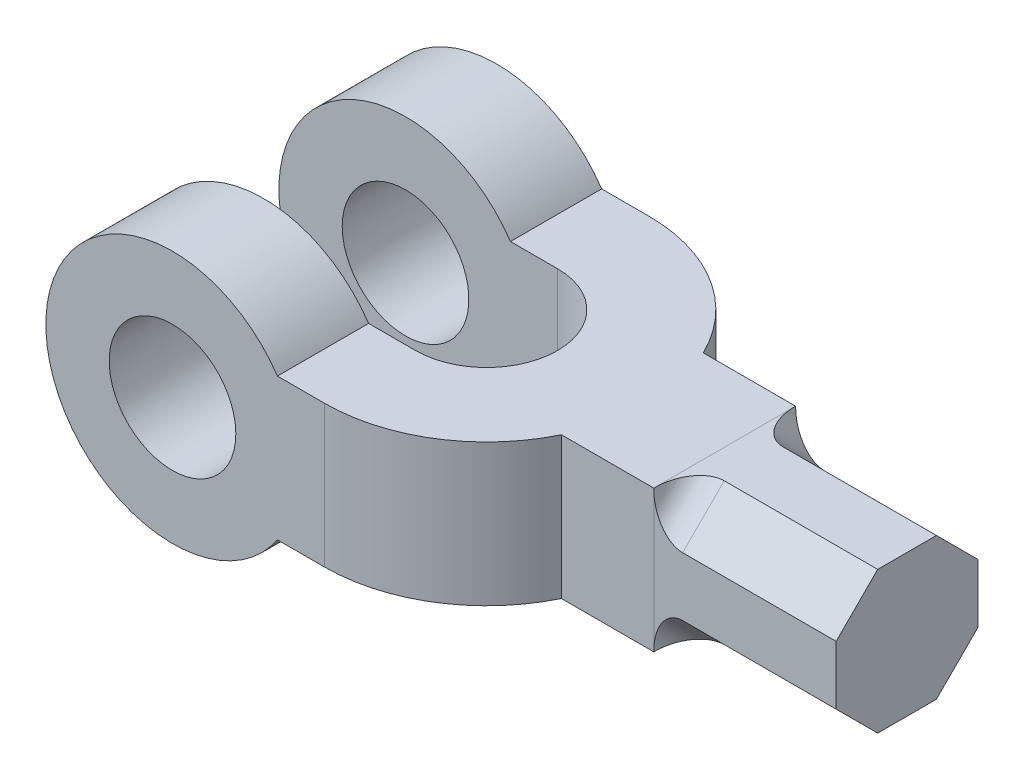
ISO-10303-21;
HEADER;
FILE_DESCRIPTION(('STEP AP214'),'2;1');
FILE_NAME('part.step','',(''),(''),'','','');
FILE_SCHEMA(('AUTOMOTIVE_DESIGN { 1 0 10303 214 1 1 1 1 }'));
ENDSEC;
DATA;
#1=APPLICATION_CONTEXT('core data for automotive mechanical design processes');
#2=APPLICATION_PROTOCOL_DEFINITION('international standard','automotive_design',2000,#1);
#3=PRODUCT_CONTEXT('',#1,'mechanical');
#4=PRODUCT('Part','Part','',(#3));
#5=PRODUCT_RELATED_PRODUCT_CATEGORY('part','',(#4));
#6=PRODUCT_DEFINITION_FORMATION('','',#4);
#7=PRODUCT_DEFINITION_CONTEXT('part definition',#1,'design');
#8=PRODUCT_DEFINITION('design','',#6,#7);
#9=PRODUCT_DEFINITION_SHAPE('','',#8);
#10=(LENGTH_UNIT() NAMED_UNIT(*) SI_UNIT(.MILLI.,.METRE.));
#11=(NAMED_UNIT(*) PLANE_ANGLE_UNIT() SI_UNIT($,.RADIAN.));
#12=(NAMED_UNIT(*) SI_UNIT($,.STERADIAN.) SOLID_ANGLE_UNIT());
#13=UNCERTAINTY_MEASURE_WITH_UNIT(LENGTH_MEASURE(1.E-05),#10,'distance_accuracy_value','');
#14=(GEOMETRIC_REPRESENTATION_CONTEXT(3) GLOBAL_UNCERTAINTY_ASSIGNED_CONTEXT((#13)) GLOBAL_UNIT_ASSIGNED_CONTEXT((#10,
#11,#12)) REPRESENTATION_CONTEXT('',''));
#15=CARTESIAN_POINT('',(0.,0.,0.));
#16=DIRECTION('',(0.,0.,1.));
#17=DIRECTION('',(1.,0.,0.));
#18=AXIS2_PLACEMENT_3D('',#15,#16,#17);
#19=CARTESIAN_POINT('',(77.,14.,14.));
#20=DIRECTION('',(-1.,0.,0.));
#21=DIRECTION('',(0.,0.,1.));
#22=AXIS2_PLACEMENT_3D('',#19,#20,#21);
#23=PLANE('',#22);
#24=CARTESIAN_POINT('',(77.,14.,14.));
#25=DIRECTION('',(0.,-1.,0.));
#26=VECTOR('',#25,1.);
#27=LINE('',#24,#26);
#28=CARTESIAN_POINT('',(77.,14.,14.));
#29=VERTEX_POINT('',#28);
#30=CARTESIAN_POINT('',(77.,13.8600034264656,14.));
#31=VERTEX_POINT('',#30);
#32=EDGE_CURVE('E58',#29,#31,#27,.T.);
#33=ORIENTED_EDGE('',*,*,#32,.T.);
#34=DIRECTION('',(0.,-0.707125784108994,0.707087777753399));
#35=VECTOR('',#34,1.);
#36=CARTESIAN_POINT('',(77.,18.0302444828851,9.82998308427523));
#37=LINE('',#36,#35);
#38=CARTESIAN_POINT('',(77.,14.,13.8600109509537));
#39=VERTEX_POINT('',#38);
#40=EDGE_CURVE('E418',#31,#39,#37,.F.);
#41=ORIENTED_EDGE('',*,*,#40,.T.);
#42=CARTESIAN_POINT('',(77.,14.,14.));
#43=DIRECTION('',(0.,0.,-1.));
#44=VECTOR('',#43,1.);
#45=LINE('',#42,#44);
#46=EDGE_CURVE('E742',#29,#39,#45,.T.);
#47=ORIENTED_EDGE('',*,*,#46,.F.);
#48=EDGE_LOOP('',(#33,#41,#47));
#49=FACE_BOUND('',#48,.T.);
#50=ADVANCED_FACE('F39',(#49),#23,.F.);
#51=CARTESIAN_POINT('',(77.,14.,-13.8600034264656));
#52=DIRECTION('',(0.,0.,-1.));
#53=VECTOR('',#52,1.);
#54=LINE('',#51,#53);
#55=CARTESIAN_POINT('',(77.,14.,-13.8600034264656));
#56=VERTEX_POINT('',#55);
#57=CARTESIAN_POINT('',(77.,14.,-14.));
#58=VERTEX_POINT('',#57);
#59=EDGE_CURVE('E409',#56,#58,#54,.T.);
#60=ORIENTED_EDGE('',*,*,#59,.F.);
#61=DIRECTION('',(0.,0.707087777753399,0.707125784108994));
#62=VECTOR('',#61,1.);
#63=CARTESIAN_POINT('',(77.,9.82998308427523,-18.0302444828851));
#64=LINE('',#63,#62);
#65=CARTESIAN_POINT('',(77.,13.8600109509537,-14.));
#66=VERTEX_POINT('',#65);
#67=EDGE_CURVE('E412',#56,#66,#64,.F.);
#68=ORIENTED_EDGE('',*,*,#67,.T.);
#69=CARTESIAN_POINT('',(77.,14.,-14.));
#70=DIRECTION('',(0.,-1.,0.));
#71=VECTOR('',#70,1.);
#72=LINE('',#69,#71);
#73=EDGE_CURVE('E296',#58,#66,#72,.T.);
#74=ORIENTED_EDGE('',*,*,#73,.F.);
#75=EDGE_LOOP('',(#60,#68,#74));
#76=FACE_BOUND('',#75,.T.);
#77=ADVANCED_FACE('F373',(#76),#23,.F.);
#78=CARTESIAN_POINT('',(77.,-13.8600034264656,-14.));
#79=DIRECTION('',(0.,-1.,0.));
#80=VECTOR('',#79,1.);
#81=LINE('',#78,#80);
#82=CARTESIAN_POINT('',(77.,-13.8600034264656,-14.));
#83=VERTEX_POINT('',#82);
#84=CARTESIAN_POINT('',(77.,-14.,-14.));
#85=VERTEX_POINT('',#84);
#86=EDGE_CURVE('E773',#83,#85,#81,.T.);
#87=ORIENTED_EDGE('',*,*,#86,.F.);
#88=DIRECTION('',(0.,0.707125784108994,-0.707087777753399));
#89=VECTOR('',#88,1.);
#90=CARTESIAN_POINT('',(77.,-18.0302444828851,-9.82998308427523));
#91=LINE('',#90,#89);
#92=CARTESIAN_POINT('',(77.,-14.,-13.8600109509537));
#93=VERTEX_POINT('',#92);
#94=EDGE_CURVE('E759',#83,#93,#91,.F.);
#95=ORIENTED_EDGE('',*,*,#94,.T.);
#96=CARTESIAN_POINT('',(77.,-14.,-13.8600109509537));
#97=DIRECTION('',(0.,0.,-1.));
#98=VECTOR('',#97,1.);
#99=LINE('',#96,#98);
#100=EDGE_CURVE('E251',#93,#85,#99,.T.);
#101=ORIENTED_EDGE('',*,*,#100,.T.);
#102=EDGE_LOOP('',(#87,#95,#101));
#103=FACE_BOUND('',#102,.T.);
#104=ADVANCED_FACE('F864',(#103),#23,.F.);
#105=CARTESIAN_POINT('',(77.,-14.,14.));
#106=DIRECTION('',(0.,0.,-1.));
#107=VECTOR('',#106,1.);
#108=LINE('',#105,#107);
#109=CARTESIAN_POINT('',(77.,-14.,14.));
#110=VERTEX_POINT('',#109);
#111=CARTESIAN_POINT('',(77.,-14.,13.8600034264656));
#112=VERTEX_POINT('',#111);
#113=EDGE_CURVE('E254',#110,#112,#108,.T.);
#114=ORIENTED_EDGE('',*,*,#113,.T.);
#115=DIRECTION('',(0.,-0.707087777753399,-0.707125784108994));
#116=VECTOR('',#115,1.);
#117=CARTESIAN_POINT('',(77.,-9.82998308427523,18.0302444828851));
#118=LINE('',#117,#116);
#119=CARTESIAN_POINT('',(77.,-13.8600109509537,14.));
#120=VERTEX_POINT('',#119);
#121=EDGE_CURVE('E751',#112,#120,#118,.F.);
#122=ORIENTED_EDGE('',*,*,#121,.T.);
#123=CARTESIAN_POINT('',(77.,-13.8600109509537,14.));
#124=DIRECTION('',(0.,-1.,0.));
#125=VECTOR('',#124,1.);
#126=LINE('',#123,#125);
#127=EDGE_CURVE('E788',#120,#110,#126,.T.);
#128=ORIENTED_EDGE('',*,*,#127,.T.);
#129=EDGE_LOOP('',(#114,#122,#128));
#130=FACE_BOUND('',#129,.T.);
#131=ADVANCED_FACE('F374',(#130),#23,.F.);
#132=CARTESIAN_POINT('',(30.,-14.,0.));
#133=DIRECTION('',(0.,1.,0.));
#134=DIRECTION('',(0.,0.,1.));
#135=AXIS2_PLACEMENT_3D('',#132,#133,#134);
#136=CYLINDRICAL_SURFACE('',#135,32.);
#137=CARTESIAN_POINT('',(30.,14.,0.));
#138=DIRECTION('',(0.,1.,0.));
#139=DIRECTION('',(0.,0.,-1.));
#140=AXIS2_PLACEMENT_3D('',#137,#138,#139);
#141=CIRCLE('',#140,32.);
#142=CARTESIAN_POINT('',(58.7749891398763,14.,-14.));
#143=VERTEX_POINT('',#142);
#144=CARTESIAN_POINT('',(30.,14.,-32.));
#145=VERTEX_POINT('',#144);
#146=EDGE_CURVE('E307',#143,#145,#141,.T.);
#147=ORIENTED_EDGE('',*,*,#146,.F.);
#148=DIRECTION('',(0.,1.,0.));
#149=VECTOR('',#148,1.);
#150=CARTESIAN_POINT('',(58.7749891398763,-14.,-14.));
#151=LINE('',#150,#149);
#152=CARTESIAN_POINT('',(58.7749891398763,-14.,-14.));
#153=VERTEX_POINT('',#152);
#154=EDGE_CURVE('E349',#143,#153,#151,.F.);
#155=ORIENTED_EDGE('',*,*,#154,.T.);
#156=CARTESIAN_POINT('',(30.,-14.,0.));
#157=DIRECTION('',(0.,1.,0.));
#158=DIRECTION('',(0.,0.,-1.));
#159=AXIS2_PLACEMENT_3D('',#156,#157,#158);
#160=CIRCLE('',#159,32.);
#161=CARTESIAN_POINT('',(30.,-14.,-32.));
#162=VERTEX_POINT('',#161);
#163=EDGE_CURVE('E300',#153,#162,#160,.T.);
#164=ORIENTED_EDGE('',*,*,#163,.T.);
#165=DIRECTION('',(0.,1.,0.));
#166=VECTOR('',#165,1.);
#167=CARTESIAN_POINT('',(30.,-14.,-32.));
#168=LINE('',#167,#166);
#169=EDGE_CURVE('E304',#162,#145,#168,.T.);
#170=ORIENTED_EDGE('',*,*,#169,.T.);
#171=EDGE_LOOP('',(#147,#155,#164,#170));
#172=FACE_BOUND('',#171,.T.);
#173=ADVANCED_FACE('F804',(#172),#136,.T.);
#174=CARTESIAN_POINT('',(30.,-14.,32.));
#175=VERTEX_POINT('',#174);
#176=CARTESIAN_POINT('',(58.7749891398763,-14.,14.));
#177=VERTEX_POINT('',#176);
#178=EDGE_CURVE('E302',#175,#177,#160,.T.);
#179=ORIENTED_EDGE('',*,*,#178,.T.);
#180=DIRECTION('',(0.,1.,0.));
#181=VECTOR('',#180,1.);
#182=CARTESIAN_POINT('',(58.7749891398763,-14.,14.));
#183=LINE('',#182,#181);
#184=CARTESIAN_POINT('',(58.7749891398763,14.,14.));
#185=VERTEX_POINT('',#184);
#186=EDGE_CURVE('E318',#177,#185,#183,.T.);
#187=ORIENTED_EDGE('',*,*,#186,.T.);
#188=CARTESIAN_POINT('',(30.,14.,32.));
#189=VERTEX_POINT('',#188);
#190=EDGE_CURVE('E301',#189,#185,#141,.T.);
#191=ORIENTED_EDGE('',*,*,#190,.F.);
#192=DIRECTION('',(0.,1.,0.));
#193=VECTOR('',#192,1.);
#194=CARTESIAN_POINT('',(30.,-14.,32.));
#195=LINE('',#194,#193);
#196=EDGE_CURVE('E325',#175,#189,#195,.T.);
#197=ORIENTED_EDGE('',*,*,#196,.F.);
#198=EDGE_LOOP('',(#179,#187,#191,#197));
#199=FACE_BOUND('',#198,.T.);
#200=ADVANCED_FACE('F516',(#199),#136,.T.);
#201=CARTESIAN_POINT('',(20.712315177208,14.,32.));
#202=DIRECTION('',(0.,-1.,0.));
#203=DIRECTION('',(0.,0.,-1.));
#204=AXIS2_PLACEMENT_3D('',#201,#202,#203);
#205=PLANE('',#204);
#206=DIRECTION('',(-1.,0.,0.));
#207=VECTOR('',#206,1.);
#208=CARTESIAN_POINT('',(47.,14.,-14.));
#209=LINE('',#208,#207);
#210=EDGE_CURVE('E790',#58,#143,#209,.T.);
#211=ORIENTED_EDGE('',*,*,#210,.T.);
#212=ORIENTED_EDGE('',*,*,#146,.T.);
#213=DIRECTION('',(-1.,0.,0.));
#214=VECTOR('',#213,1.);
#215=CARTESIAN_POINT('',(20.712315177208,14.,-32.));
#216=LINE('',#215,#214);
#217=CARTESIAN_POINT('',(20.712315177208,14.,-32.));
#218=VERTEX_POINT('',#217);
#219=EDGE_CURVE('E280',#145,#218,#216,.T.);
#220=ORIENTED_EDGE('',*,*,#219,.T.);
#221=DIRECTION('',(0.,0.,-1.));
#222=VECTOR('',#221,1.);
#223=CARTESIAN_POINT('',(20.712315177208,14.,32.));
#224=LINE('',#223,#222);
#225=CARTESIAN_POINT('',(20.712315177208,14.,-14.));
#226=VERTEX_POINT('',#225);
#227=EDGE_CURVE('E291',#226,#218,#224,.T.);
#228=ORIENTED_EDGE('',*,*,#227,.F.);
#229=DIRECTION('',(1.,0.,0.));
#230=VECTOR('',#229,1.);
#231=CARTESIAN_POINT('',(20.712315177208,14.,-14.));
#232=LINE('',#231,#230);
#233=CARTESIAN_POINT('',(30.,14.,-14.));
#234=VERTEX_POINT('',#233);
#235=EDGE_CURVE('E274',#226,#234,#232,.T.);
#236=ORIENTED_EDGE('',*,*,#235,.T.);
#237=CARTESIAN_POINT('',(30.,14.,0.));
#238=DIRECTION('',(0.,-1.,0.));
#239=DIRECTION('',(0.,0.,-1.));
#240=AXIS2_PLACEMENT_3D('',#237,#238,#239);
#241=CIRCLE('',#240,14.);
#242=CARTESIAN_POINT('',(30.,14.,14.));
#243=VERTEX_POINT('',#242);
#244=EDGE_CURVE('E293',#234,#243,#241,.T.);
#245=ORIENTED_EDGE('',*,*,#244,.T.);
#246=DIRECTION('',(-1.,0.,0.));
#247=VECTOR('',#246,1.);
#248=CARTESIAN_POINT('',(20.712315177208,14.,14.));
#249=LINE('',#248,#247);
#250=CARTESIAN_POINT('',(20.712315177208,14.,14.));
#251=VERTEX_POINT('',#250);
#252=EDGE_CURVE('E332',#243,#251,#249,.T.);
#253=ORIENTED_EDGE('',*,*,#252,.T.);
#254=DIRECTION('',(0.,0.,-1.));
#255=VECTOR('',#254,1.);
#256=CARTESIAN_POINT('',(20.712315177208,14.,32.));
#257=LINE('',#256,#255);
#258=CARTESIAN_POINT('',(20.712315177208,14.,32.));
#259=VERTEX_POINT('',#258);
#260=EDGE_CURVE('E335',#259,#251,#257,.T.);
#261=ORIENTED_EDGE('',*,*,#260,.F.);
#262=DIRECTION('',(-1.,0.,0.));
#263=VECTOR('',#262,1.);
#264=CARTESIAN_POINT('',(20.712315177208,14.,32.));
#265=LINE('',#264,#263);
#266=EDGE_CURVE('E323',#189,#259,#265,.T.);
#267=ORIENTED_EDGE('',*,*,#266,.F.);
#268=ORIENTED_EDGE('',*,*,#190,.T.);
#269=DIRECTION('',(1.,0.,0.));
#270=VECTOR('',#269,1.);
#271=CARTESIAN_POINT('',(47.,14.,14.));
#272=LINE('',#271,#270);
#273=EDGE_CURVE('E395',#185,#29,#272,.T.);
#274=ORIENTED_EDGE('',*,*,#273,.T.);
#275=ORIENTED_EDGE('',*,*,#46,.T.);
#276=CARTESIAN_POINT('',(77.,13.9998441512061,5.79930972727387));
#277=DIRECTION('',(0.,-2.68745517690249E-05,0.999999999638879));
#278=VECTOR('',#277,1.);
#279=LINE('',#276,#278);
#280=CARTESIAN_POINT('',(77.,13.9999569225355,5.79930973146224));
#281=VERTEX_POINT('',#280);
#282=EDGE_CURVE('E11',#281,#39,#279,.T.);
#283=ORIENTED_EDGE('',*,*,#282,.F.);
#284=CARTESIAN_POINT('',(77.,14.0001558401979,-5.79861362740442));
#285=DIRECTION('',(0.,-2.68745517690833E-05,0.999999999638879));
#286=VECTOR('',#285,1.);
#287=LINE('',#284,#286);
#288=CARTESIAN_POINT('',(77.,14.0000430716729,-5.79867001469759));
#289=VERTEX_POINT('',#288);
#290=EDGE_CURVE('E245',#289,#281,#287,.T.);
#291=ORIENTED_EDGE('',*,*,#290,.F.);
#292=CARTESIAN_POINT('',(77.,14.,-5.79867001469759));
#293=DIRECTION('',(0.,0.,-1.));
#294=VECTOR('',#293,1.);
#295=LINE('',#292,#294);
#296=EDGE_CURVE('E499',#289,#56,#295,.T.);
#297=ORIENTED_EDGE('',*,*,#296,.T.);
#298=ORIENTED_EDGE('',*,*,#59,.T.);
#299=EDGE_LOOP('',(#211,#212,#220,#228,#236,#245,#253,#261,#267,#268,#274,#275,#283,#291,#297,#298));
#300=FACE_BOUND('',#299,.T.);
#301=ADVANCED_FACE('F507',(#300),#205,.F.);
#302=CARTESIAN_POINT('',(0.,0.,32.));
#303=DIRECTION('',(0.,0.,-1.));
#304=DIRECTION('',(-1.,0.,0.));
#305=AXIS2_PLACEMENT_3D('',#302,#303,#304);
#306=CYLINDRICAL_SURFACE('',#305,25.);
#307=ORIENTED_EDGE('',*,*,#260,.T.);
#308=CARTESIAN_POINT('',(0.,0.,14.));
#309=DIRECTION('',(0.,0.,1.));
#310=DIRECTION('',(1.,0.,0.));
#311=AXIS2_PLACEMENT_3D('',#308,#309,#310);
#312=CIRCLE('',#311,25.);
#313=CARTESIAN_POINT('',(20.712315177208,-14.,14.));
#314=VERTEX_POINT('',#313);
#315=EDGE_CURVE('E336',#251,#314,#312,.T.);
#316=ORIENTED_EDGE('',*,*,#315,.T.);
#317=DIRECTION('',(0.,0.,-1.));
#318=VECTOR('',#317,1.);
#319=CARTESIAN_POINT('',(20.712315177208,-14.,32.));
#320=LINE('',#319,#318);
#321=CARTESIAN_POINT('',(20.712315177208,-14.,32.));
#322=VERTEX_POINT('',#321);
#323=EDGE_CURVE('E339',#322,#314,#320,.T.);
#324=ORIENTED_EDGE('',*,*,#323,.F.);
#325=CARTESIAN_POINT('',(0.,0.,32.));
#326=DIRECTION('',(0.,0.,1.));
#327=DIRECTION('',(1.,0.,0.));
#328=AXIS2_PLACEMENT_3D('',#325,#326,#327);
#329=CIRCLE('',#328,25.);
#330=EDGE_CURVE('E321',#259,#322,#329,.T.);
#331=ORIENTED_EDGE('',*,*,#330,.F.);
#332=EDGE_LOOP('',(#307,#316,#324,#331));
#333=FACE_BOUND('',#332,.T.);
#334=ADVANCED_FACE('F475',(#333),#306,.T.);
#335=CARTESIAN_POINT('',(20.712315177208,-14.,32.));
#336=DIRECTION('',(0.,1.,0.));
#337=DIRECTION('',(0.,0.,1.));
#338=AXIS2_PLACEMENT_3D('',#335,#336,#337);
#339=PLANE('',#338);
#340=ORIENTED_EDGE('',*,*,#163,.F.);
#341=DIRECTION('',(-1.,0.,0.));
#342=VECTOR('',#341,1.);
#343=CARTESIAN_POINT('',(47.,-14.,-14.));
#344=LINE('',#343,#342);
#345=EDGE_CURVE('E794',#85,#153,#344,.T.);
#346=ORIENTED_EDGE('',*,*,#345,.F.);
#347=ORIENTED_EDGE('',*,*,#100,.F.);
#348=CARTESIAN_POINT('',(77.,-13.9998441512061,-5.79930972727387));
#349=DIRECTION('',(0.,2.68745517692401E-05,-0.999999999638879));
#350=VECTOR('',#349,1.);
#351=LINE('',#348,#350);
#352=CARTESIAN_POINT('',(77.,-13.9999569225355,-5.79930973146223));
#353=VERTEX_POINT('',#352);
#354=EDGE_CURVE('E744',#353,#93,#351,.T.);
#355=ORIENTED_EDGE('',*,*,#354,.F.);
#356=CARTESIAN_POINT('',(77.,-14.0001558401979,5.79861362740443));
#357=DIRECTION('',(0.,2.68745517692329E-05,-0.999999999638879));
#358=VECTOR('',#357,1.);
#359=LINE('',#356,#358);
#360=CARTESIAN_POINT('',(77.,-14.0000430716729,5.79867001469758));
#361=VERTEX_POINT('',#360);
#362=EDGE_CURVE('E699',#361,#353,#359,.T.);
#363=ORIENTED_EDGE('',*,*,#362,.F.);
#364=CARTESIAN_POINT('',(77.,-14.,5.79867001469758));
#365=DIRECTION('',(0.,0.,1.));
#366=VECTOR('',#365,1.);
#367=LINE('',#364,#366);
#368=EDGE_CURVE('E453',#361,#112,#367,.T.);
#369=ORIENTED_EDGE('',*,*,#368,.T.);
#370=ORIENTED_EDGE('',*,*,#113,.F.);
#371=DIRECTION('',(1.,0.,0.));
#372=VECTOR('',#371,1.);
#373=CARTESIAN_POINT('',(47.,-14.,14.));
#374=LINE('',#373,#372);
#375=EDGE_CURVE('E793',#177,#110,#374,.T.);
#376=ORIENTED_EDGE('',*,*,#375,.F.);
#377=ORIENTED_EDGE('',*,*,#178,.F.);
#378=DIRECTION('',(1.,0.,0.));
#379=VECTOR('',#378,1.);
#380=CARTESIAN_POINT('',(20.712315177208,-14.,32.));
#381=LINE('',#380,#379);
#382=EDGE_CURVE('E319',#322,#175,#381,.T.);
#383=ORIENTED_EDGE('',*,*,#382,.F.);
#384=ORIENTED_EDGE('',*,*,#323,.T.);
#385=DIRECTION('',(1.,0.,0.));
#386=VECTOR('',#385,1.);
#387=CARTESIAN_POINT('',(20.712315177208,-14.,14.));
#388=LINE('',#387,#386);
#389=CARTESIAN_POINT('',(30.,-14.,14.));
#390=VERTEX_POINT('',#389);
#391=EDGE_CURVE('E331',#314,#390,#388,.T.);
#392=ORIENTED_EDGE('',*,*,#391,.T.);
#393=CARTESIAN_POINT('',(30.,-14.,0.));
#394=DIRECTION('',(0.,-1.,0.));
#395=DIRECTION('',(0.,0.,-1.));
#396=AXIS2_PLACEMENT_3D('',#393,#394,#395);
#397=CIRCLE('',#396,14.);
#398=CARTESIAN_POINT('',(30.,-14.,-14.));
#399=VERTEX_POINT('',#398);
#400=EDGE_CURVE('E297',#399,#390,#397,.T.);
#401=ORIENTED_EDGE('',*,*,#400,.F.);
#402=DIRECTION('',(-1.,0.,0.));
#403=VECTOR('',#402,1.);
#404=CARTESIAN_POINT('',(20.712315177208,-14.,-14.));
#405=LINE('',#404,#403);
#406=CARTESIAN_POINT('',(20.712315177208,-14.,-14.));
#407=VERTEX_POINT('',#406);
#408=EDGE_CURVE('E267',#399,#407,#405,.T.);
#409=ORIENTED_EDGE('',*,*,#408,.T.);
#410=DIRECTION('',(0.,0.,-1.));
#411=VECTOR('',#410,1.);
#412=CARTESIAN_POINT('',(20.712315177208,-14.,32.));
#413=LINE('',#412,#411);
#414=CARTESIAN_POINT('',(20.712315177208,-14.,-32.));
#415=VERTEX_POINT('',#414);
#416=EDGE_CURVE('E289',#407,#415,#413,.T.);
#417=ORIENTED_EDGE('',*,*,#416,.T.);
#418=DIRECTION('',(1.,0.,0.));
#419=VECTOR('',#418,1.);
#420=CARTESIAN_POINT('',(20.712315177208,-14.,-32.));
#421=LINE('',#420,#419);
#422=EDGE_CURVE('E286',#415,#162,#421,.T.);
#423=ORIENTED_EDGE('',*,*,#422,.T.);
#424=EDGE_LOOP('',(#340,#346,#347,#355,#363,#369,#370,#376,#377,#383,#384,#392,#401,#409,#417,#423));
#425=FACE_BOUND('',#424,.T.);
#426=ADVANCED_FACE('F464',(#425),#339,.F.);
#427=CARTESIAN_POINT('',(0.,0.,32.));
#428=DIRECTION('',(0.,0.,-1.));
#429=DIRECTION('',(-1.,0.,0.));
#430=AXIS2_PLACEMENT_3D('',#427,#428,#429);
#431=CYLINDRICAL_SURFACE('',#430,12.5);
#432=CARTESIAN_POINT('',(0.,0.,14.));
#433=DIRECTION('',(0.,0.,1.));
#434=DIRECTION('',(1.,0.,0.));
#435=AXIS2_PLACEMENT_3D('',#432,#433,#434);
#436=CIRCLE('',#435,12.5);
#437=CARTESIAN_POINT('',(12.5,0.,14.));
#438=VERTEX_POINT('',#437);
#439=EDGE_CURVE('E315',#438,#438,#436,.T.);
#440=ORIENTED_EDGE('',*,*,#439,.F.);
#441=EDGE_LOOP('',(#440));
#442=FACE_BOUND('',#441,.T.);
#443=CARTESIAN_POINT('',(0.,0.,32.));
#444=DIRECTION('',(0.,0.,1.));
#445=DIRECTION('',(1.,0.,0.));
#446=AXIS2_PLACEMENT_3D('',#443,#444,#445);
#447=CIRCLE('',#446,12.5);
#448=CARTESIAN_POINT('',(12.5,0.,32.));
#449=VERTEX_POINT('',#448);
#450=EDGE_CURVE('E328',#449,#449,#447,.T.);
#451=ORIENTED_EDGE('',*,*,#450,.T.);
#452=EDGE_LOOP('',(#451));
#453=FACE_BOUND('',#452,.T.);
#454=ADVANCED_FACE('F474',(#442,#453),#431,.F.);
#455=CARTESIAN_POINT('',(0.,0.,32.));
#456=DIRECTION('',(0.,0.,1.));
#457=DIRECTION('',(1.,0.,0.));
#458=AXIS2_PLACEMENT_3D('',#455,#456,#457);
#459=PLANE('',#458);
#460=ORIENTED_EDGE('',*,*,#196,.T.);
#461=ORIENTED_EDGE('',*,*,#266,.T.);
#462=ORIENTED_EDGE('',*,*,#330,.T.);
#463=ORIENTED_EDGE('',*,*,#382,.T.);
#464=EDGE_LOOP('',(#460,#461,#462,#463));
#465=FACE_BOUND('',#464,.T.);
#466=ORIENTED_EDGE('',*,*,#450,.F.);
#467=EDGE_LOOP('',(#466));
#468=FACE_BOUND('',#467,.T.);
#469=ADVANCED_FACE('F830',(#465,#468),#459,.T.);
#470=CARTESIAN_POINT('',(-80.,-32.,14.));
#471=DIRECTION('',(0.,0.,1.));
#472=DIRECTION('',(1.,0.,0.));
#473=AXIS2_PLACEMENT_3D('',#470,#471,#472);
#474=PLANE('',#473);
#475=ORIENTED_EDGE('',*,*,#439,.T.);
#476=EDGE_LOOP('',(#475));
#477=FACE_BOUND('',#476,.T.);
#478=DIRECTION('',(0.,1.,0.));
#479=VECTOR('',#478,1.);
#480=CARTESIAN_POINT('',(30.,-32.,14.));
#481=LINE('',#480,#479);
#482=EDGE_CURVE('E312',#390,#243,#481,.T.);
#483=ORIENTED_EDGE('',*,*,#482,.F.);
#484=ORIENTED_EDGE('',*,*,#391,.F.);
#485=ORIENTED_EDGE('',*,*,#315,.F.);
#486=ORIENTED_EDGE('',*,*,#252,.F.);
#487=EDGE_LOOP('',(#483,#484,#485,#486));
#488=FACE_BOUND('',#487,.T.);
#489=ADVANCED_FACE('F477',(#477,#488),#474,.F.);
#490=CARTESIAN_POINT('',(30.,-14.,0.));
#491=DIRECTION('',(0.,1.,0.));
#492=DIRECTION('',(0.,0.,1.));
#493=AXIS2_PLACEMENT_3D('',#490,#491,#492);
#494=CYLINDRICAL_SURFACE('',#493,14.);
#495=ORIENTED_EDGE('',*,*,#244,.F.);
#496=DIRECTION('',(0.,1.,0.));
#497=VECTOR('',#496,1.);
#498=CARTESIAN_POINT('',(30.,-14.,-14.));
#499=LINE('',#498,#497);
#500=EDGE_CURVE('E310',#399,#234,#499,.T.);
#501=ORIENTED_EDGE('',*,*,#500,.F.);
#502=ORIENTED_EDGE('',*,*,#400,.T.);
#503=ORIENTED_EDGE('',*,*,#482,.T.);
#504=EDGE_LOOP('',(#495,#501,#502,#503));
#505=FACE_BOUND('',#504,.T.);
#506=ADVANCED_FACE('F818',(#505),#494,.F.);
#507=CARTESIAN_POINT('',(0.,0.,32.));
#508=DIRECTION('',(0.,0.,-1.));
#509=DIRECTION('',(-1.,0.,0.));
#510=AXIS2_PLACEMENT_3D('',#507,#508,#509);
#511=CYLINDRICAL_SURFACE('',#510,25.);
#512=ORIENTED_EDGE('',*,*,#416,.F.);
#513=CARTESIAN_POINT('',(0.,0.,-14.));
#514=DIRECTION('',(0.,0.,-1.));
#515=DIRECTION('',(-1.,0.,0.));
#516=AXIS2_PLACEMENT_3D('',#513,#514,#515);
#517=CIRCLE('',#516,25.);
#518=EDGE_CURVE('E270',#407,#226,#517,.T.);
#519=ORIENTED_EDGE('',*,*,#518,.T.);
#520=ORIENTED_EDGE('',*,*,#227,.T.);
#521=CARTESIAN_POINT('',(0.,0.,-32.));
#522=DIRECTION('',(0.,0.,1.));
#523=DIRECTION('',(1.,0.,0.));
#524=AXIS2_PLACEMENT_3D('',#521,#522,#523);
#525=CIRCLE('',#524,25.);
#526=EDGE_CURVE('E283',#218,#415,#525,.T.);
#527=ORIENTED_EDGE('',*,*,#526,.T.);
#528=EDGE_LOOP('',(#512,#519,#520,#527));
#529=FACE_BOUND('',#528,.T.);
#530=ADVANCED_FACE('F813',(#529),#511,.T.);
#531=CARTESIAN_POINT('',(0.,0.,-32.));
#532=DIRECTION('',(0.,0.,1.));
#533=DIRECTION('',(1.,0.,0.));
#534=AXIS2_PLACEMENT_3D('',#531,#532,#533);
#535=PLANE('',#534);
#536=ORIENTED_EDGE('',*,*,#169,.F.);
#537=ORIENTED_EDGE('',*,*,#422,.F.);
#538=ORIENTED_EDGE('',*,*,#526,.F.);
#539=ORIENTED_EDGE('',*,*,#219,.F.);
#540=EDGE_LOOP('',(#536,#537,#538,#539));
#541=FACE_BOUND('',#540,.T.);
#542=CARTESIAN_POINT('',(0.,0.,-32.));
#543=DIRECTION('',(0.,0.,1.));
#544=DIRECTION('',(1.,0.,0.));
#545=AXIS2_PLACEMENT_3D('',#542,#543,#544);
#546=CIRCLE('',#545,12.5);
#547=CARTESIAN_POINT('',(12.5,0.,-32.));
#548=VERTEX_POINT('',#547);
#549=EDGE_CURVE('E277',#548,#548,#546,.T.);
#550=ORIENTED_EDGE('',*,*,#549,.T.);
#551=EDGE_LOOP('',(#550));
#552=FACE_BOUND('',#551,.T.);
#553=ADVANCED_FACE('F809',(#541,#552),#535,.F.);
#554=CARTESIAN_POINT('',(0.,0.,32.));
#555=DIRECTION('',(0.,0.,-1.));
#556=DIRECTION('',(-1.,0.,0.));
#557=AXIS2_PLACEMENT_3D('',#554,#555,#556);
#558=CYLINDRICAL_SURFACE('',#557,12.5);
#559=CARTESIAN_POINT('',(0.,0.,-14.));
#560=DIRECTION('',(0.,0.,-1.));
#561=DIRECTION('',(-1.,0.,0.));
#562=AXIS2_PLACEMENT_3D('',#559,#560,#561);
#563=CIRCLE('',#562,12.5);
#564=CARTESIAN_POINT('',(-12.5,0.,-14.));
#565=VERTEX_POINT('',#564);
#566=EDGE_CURVE('E271',#565,#565,#563,.T.);
#567=ORIENTED_EDGE('',*,*,#566,.F.);
#568=EDGE_LOOP('',(#567));
#569=FACE_BOUND('',#568,.T.);
#570=ORIENTED_EDGE('',*,*,#549,.F.);
#571=EDGE_LOOP('',(#570));
#572=FACE_BOUND('',#571,.T.);
#573=ADVANCED_FACE('F1036',(#569,#572),#558,.F.);
#574=CARTESIAN_POINT('',(-80.,-32.,-14.));
#575=DIRECTION('',(0.,0.,-1.));
#576=DIRECTION('',(-1.,0.,0.));
#577=AXIS2_PLACEMENT_3D('',#574,#575,#576);
#578=PLANE('',#577);
#579=ORIENTED_EDGE('',*,*,#566,.T.);
#580=EDGE_LOOP('',(#579));
#581=FACE_BOUND('',#580,.T.);
#582=ORIENTED_EDGE('',*,*,#518,.F.);
#583=ORIENTED_EDGE('',*,*,#408,.F.);
#584=ORIENTED_EDGE('',*,*,#500,.T.);
#585=ORIENTED_EDGE('',*,*,#235,.F.);
#586=EDGE_LOOP('',(#582,#583,#584,#585));
#587=FACE_BOUND('',#586,.T.);
#588=ADVANCED_FACE('F378',(#581,#587),#578,.F.);
#589=CARTESIAN_POINT('',(47.,14.,-14.));
#590=DIRECTION('',(0.,0.,1.));
#591=DIRECTION('',(1.,0.,0.));
#592=AXIS2_PLACEMENT_3D('',#589,#590,#591);
#593=PLANE('',#592);
#594=ORIENTED_EDGE('',*,*,#154,.F.);
#595=ORIENTED_EDGE('',*,*,#210,.F.);
#596=ORIENTED_EDGE('',*,*,#73,.T.);
#597=CARTESIAN_POINT('',(77.,5.79930972727387,-13.9998441512061));
#598=DIRECTION('',(0.,0.999999999638879,2.68745517692401E-05));
#599=VECTOR('',#598,1.);
#600=LINE('',#597,#599);
#601=CARTESIAN_POINT('',(77.,5.79930973146224,-13.9999569225355));
#602=VERTEX_POINT('',#601);
#603=EDGE_CURVE('E619',#602,#66,#600,.T.);
#604=ORIENTED_EDGE('',*,*,#603,.F.);
#605=CARTESIAN_POINT('',(77.,-5.79861362740442,-14.0001558401979));
#606=DIRECTION('',(0.,0.999999999638879,2.68745517692329E-05));
#607=VECTOR('',#606,1.);
#608=LINE('',#605,#607);
#609=CARTESIAN_POINT('',(77.,-5.79867001469758,-14.0000430716729));
#610=VERTEX_POINT('',#609);
#611=EDGE_CURVE('E698',#610,#602,#608,.T.);
#612=ORIENTED_EDGE('',*,*,#611,.F.);
#613=CARTESIAN_POINT('',(77.,-5.79867001469758,-14.));
#614=DIRECTION('',(0.,-1.,0.));
#615=VECTOR('',#614,1.);
#616=LINE('',#613,#615);
#617=EDGE_CURVE('E577',#610,#83,#616,.T.);
#618=ORIENTED_EDGE('',*,*,#617,.T.);
#619=ORIENTED_EDGE('',*,*,#86,.T.);
#620=ORIENTED_EDGE('',*,*,#345,.T.);
#621=EDGE_LOOP('',(#594,#595,#596,#604,#612,#618,#619,#620));
#622=FACE_BOUND('',#621,.T.);
#623=ADVANCED_FACE('F375',(#622),#593,.F.);
#624=CARTESIAN_POINT('',(47.,14.,14.));
#625=DIRECTION('',(0.,0.,-1.));
#626=DIRECTION('',(-1.,0.,0.));
#627=AXIS2_PLACEMENT_3D('',#624,#625,#626);
#628=PLANE('',#627);
#629=ORIENTED_EDGE('',*,*,#186,.F.);
#630=ORIENTED_EDGE('',*,*,#375,.T.);
#631=ORIENTED_EDGE('',*,*,#127,.F.);
#632=CARTESIAN_POINT('',(77.,-5.79930972727387,13.9998441512061));
#633=DIRECTION('',(0.,-0.999999999638879,-2.68745517692401E-05));
#634=VECTOR('',#633,1.);
#635=LINE('',#632,#634);
#636=CARTESIAN_POINT('',(77.,-5.79930973146224,13.9999569225355));
#637=VERTEX_POINT('',#636);
#638=EDGE_CURVE('E655',#637,#120,#635,.T.);
#639=ORIENTED_EDGE('',*,*,#638,.F.);
#640=CARTESIAN_POINT('',(77.,5.79861362740443,14.0001558401979));
#641=DIRECTION('',(0.,-0.999999999638879,-2.68745517693825E-05));
#642=VECTOR('',#641,1.);
#643=LINE('',#640,#642);
#644=CARTESIAN_POINT('',(77.,5.79867001469759,14.0000430716729));
#645=VERTEX_POINT('',#644);
#646=EDGE_CURVE('E544',#645,#637,#643,.T.);
#647=ORIENTED_EDGE('',*,*,#646,.F.);
#648=CARTESIAN_POINT('',(77.,5.79867001469759,14.));
#649=DIRECTION('',(0.,1.,0.));
#650=VECTOR('',#649,1.);
#651=LINE('',#648,#650);
#652=EDGE_CURVE('E51',#645,#31,#651,.T.);
#653=ORIENTED_EDGE('',*,*,#652,.T.);
#654=ORIENTED_EDGE('',*,*,#32,.F.);
#655=ORIENTED_EDGE('',*,*,#273,.F.);
#656=EDGE_LOOP('',(#629,#630,#631,#639,#647,#653,#654,#655));
#657=FACE_BOUND('',#656,.T.);
#658=ADVANCED_FACE('F552',(#657),#628,.F.);
#659=CARTESIAN_POINT('',(113.,13.9998441496908,5.79936611485396));
#660=DIRECTION('',(0.,-0.707087777753399,-0.707125784108994));
#661=DIRECTION('',(0.,0.707125784108994,-0.707087777753399));
#662=AXIS2_PLACEMENT_3D('',#659,#660,#661);
#663=PLANE('',#662);
#664=DIRECTION('',(-1.,0.,0.));
#665=VECTOR('',#664,1.);
#666=CARTESIAN_POINT('',(113.,13.9998441496908,5.79936611485396));
#667=LINE('',#666,#665);
#668=CARTESIAN_POINT('',(113.,13.9998441496908,5.79936611485396));
#669=VERTEX_POINT('',#668);
#670=CARTESIAN_POINT('',(82.7,13.9998441496908,5.79936611485396));
#671=VERTEX_POINT('',#670);
#672=EDGE_CURVE('E703',#669,#671,#667,.T.);
#673=ORIENTED_EDGE('',*,*,#672,.T.);
#674=DIRECTION('',(0.,-0.707125784108994,0.707087777753399));
#675=VECTOR('',#674,1.);
#676=CARTESIAN_POINT('',(82.7,5.79861362740443,14.0001558401979));
#677=LINE('',#676,#675);
#678=CARTESIAN_POINT('',(82.7,5.79861362740443,14.0001558401979));
#679=VERTEX_POINT('',#678);
#680=EDGE_CURVE('E250',#671,#679,#677,.T.);
#681=ORIENTED_EDGE('',*,*,#680,.T.);
#682=DIRECTION('',(-1.,0.,0.));
#683=VECTOR('',#682,1.);
#684=CARTESIAN_POINT('',(113.,5.79861362740443,14.0001558401979));
#685=LINE('',#684,#683);
#686=CARTESIAN_POINT('',(113.,5.79861362740443,14.0001558401979));
#687=VERTEX_POINT('',#686);
#688=EDGE_CURVE('E230',#687,#679,#685,.T.);
#689=ORIENTED_EDGE('',*,*,#688,.F.);
#690=DIRECTION('',(0.,-0.707125784108994,0.707087777753399));
#691=VECTOR('',#690,1.);
#692=CARTESIAN_POINT('',(113.,13.9998441496908,5.79936611485396));
#693=LINE('',#692,#691);
#694=EDGE_CURVE('E236',#669,#687,#693,.T.);
#695=ORIENTED_EDGE('',*,*,#694,.F.);
#696=EDGE_LOOP('',(#673,#681,#689,#695));
#697=FACE_BOUND('',#696,.T.);
#698=ADVANCED_FACE('F248',(#697),#663,.F.);
#699=CARTESIAN_POINT('',(113.,5.79861362740443,14.0001558401979));
#700=DIRECTION('',(0.,2.68745517693825E-05,-0.999999999638879));
#701=DIRECTION('',(0.,0.999999999638879,2.68745517693825E-05));
#702=AXIS2_PLACEMENT_3D('',#699,#700,#701);
#703=PLANE('',#702);
#704=ORIENTED_EDGE('',*,*,#646,.T.);
#705=ORIENTED_EDGE('',*,*,#638,.T.);
#706=CARTESIAN_POINT('',(82.7,-13.8603834174696,13.9996275134639));
#707=DIRECTION('',(0.,2.68745517693825E-05,-0.999999999638879));
#708=DIRECTION('',(0.,0.999999999638879,2.68745517693825E-05));
#709=AXIS2_PLACEMENT_3D('',#706,#707,#708);
#710=ELLIPSE('',#709,8.06101730552665,5.7);
#711=CARTESIAN_POINT('',(82.7,-5.79936611485396,13.9998441496907));
#712=VERTEX_POINT('',#711);
#713=EDGE_CURVE('E424',#120,#712,#710,.T.);
#714=ORIENTED_EDGE('',*,*,#713,.T.);
#715=DIRECTION('',(-1.,0.,0.));
#716=VECTOR('',#715,1.);
#717=CARTESIAN_POINT('',(113.,-5.79936611485396,13.9998441496907));
#718=LINE('',#717,#716);
#719=CARTESIAN_POINT('',(113.,-5.79936611485396,13.9998441496907));
#720=VERTEX_POINT('',#719);
#721=EDGE_CURVE('E232',#720,#712,#718,.T.);
#722=ORIENTED_EDGE('',*,*,#721,.F.);
#723=DIRECTION('',(0.,-0.999999999638879,-2.68745517693825E-05));
#724=VECTOR('',#723,1.);
#725=CARTESIAN_POINT('',(113.,5.79861362740443,14.0001558401979));
#726=LINE('',#725,#724);
#727=EDGE_CURVE('E225',#687,#720,#726,.T.);
#728=ORIENTED_EDGE('',*,*,#727,.F.);
#729=ORIENTED_EDGE('',*,*,#688,.T.);
#730=CARTESIAN_POINT('',(82.7,13.8596309300201,14.0003724764248));
#731=DIRECTION('',(0.,2.68745517693825E-05,-0.999999999638879));
#732=DIRECTION('',(0.,0.999999999638879,2.68745517693825E-05));
#733=AXIS2_PLACEMENT_3D('',#730,#731,#732);
#734=ELLIPSE('',#733,8.06101730552664,5.7);
#735=EDGE_CURVE('E445',#679,#31,#734,.T.);
#736=ORIENTED_EDGE('',*,*,#735,.T.);
#737=ORIENTED_EDGE('',*,*,#652,.F.);
#738=EDGE_LOOP('',(#704,#705,#714,#722,#728,#729,#736,#737));
#739=FACE_BOUND('',#738,.T.);
#740=ADVANCED_FACE('F228',(#739),#703,.F.);
#741=CARTESIAN_POINT('',(113.,-5.79936611485396,13.9998441496907));
#742=DIRECTION('',(0.,0.707125784108994,-0.707087777753399));
#743=DIRECTION('',(0.,0.707087777753399,0.707125784108994));
#744=AXIS2_PLACEMENT_3D('',#741,#742,#743);
#745=PLANE('',#744);
#746=ORIENTED_EDGE('',*,*,#721,.T.);
#747=DIRECTION('',(0.,-0.707087777753399,-0.707125784108994));
#748=VECTOR('',#747,1.);
#749=CARTESIAN_POINT('',(82.7,-14.0001558401979,5.79861362740443));
#750=LINE('',#749,#748);
#751=CARTESIAN_POINT('',(82.7,-14.0001558401979,5.79861362740443));
#752=VERTEX_POINT('',#751);
#753=EDGE_CURVE('E352',#712,#752,#750,.T.);
#754=ORIENTED_EDGE('',*,*,#753,.T.);
#755=DIRECTION('',(-1.,0.,0.));
#756=VECTOR('',#755,1.);
#757=CARTESIAN_POINT('',(113.,-14.0001558401979,5.79861362740443));
#758=LINE('',#757,#756);
#759=CARTESIAN_POINT('',(113.,-14.0001558401979,5.79861362740443));
#760=VERTEX_POINT('',#759);
#761=EDGE_CURVE('E255',#760,#752,#758,.T.);
#762=ORIENTED_EDGE('',*,*,#761,.F.);
#763=DIRECTION('',(0.,-0.707087777753399,-0.707125784108994));
#764=VECTOR('',#763,1.);
#765=CARTESIAN_POINT('',(113.,-5.79936611485396,13.9998441496907));
#766=LINE('',#765,#764);
#767=EDGE_CURVE('E235',#720,#760,#766,.T.);
#768=ORIENTED_EDGE('',*,*,#767,.F.);
#769=EDGE_LOOP('',(#746,#754,#762,#768));
#770=FACE_BOUND('',#769,.T.);
#771=ADVANCED_FACE('F643',(#770),#745,.F.);
#772=CARTESIAN_POINT('',(113.,-14.0001558401979,5.79861362740443));
#773=DIRECTION('',(0.,0.999999999638879,2.68745517692329E-05));
#774=DIRECTION('',(0.,-2.68745517692329E-05,0.999999999638879));
#775=AXIS2_PLACEMENT_3D('',#772,#773,#774);
#776=PLANE('',#775);
#777=ORIENTED_EDGE('',*,*,#362,.T.);
#778=ORIENTED_EDGE('',*,*,#354,.T.);
#779=CARTESIAN_POINT('',(82.7,-13.9996275134639,-13.8603834174696));
#780=DIRECTION('',(0.,0.999999999638879,2.68745517692329E-05));
#781=DIRECTION('',(0.,-2.68745517692329E-05,0.999999999638879));
#782=AXIS2_PLACEMENT_3D('',#779,#780,#781);
#783=ELLIPSE('',#782,8.06101730552665,5.7);
#784=CARTESIAN_POINT('',(82.7,-13.9998441496907,-5.79936611485396));
#785=VERTEX_POINT('',#784);
#786=EDGE_CURVE('E433',#93,#785,#783,.T.);
#787=ORIENTED_EDGE('',*,*,#786,.T.);
#788=DIRECTION('',(-1.,0.,0.));
#789=VECTOR('',#788,1.);
#790=CARTESIAN_POINT('',(113.,-13.9998441496907,-5.79936611485396));
#791=LINE('',#790,#789);
#792=CARTESIAN_POINT('',(113.,-13.9998441496907,-5.79936611485396));
#793=VERTEX_POINT('',#792);
#794=EDGE_CURVE('E691',#793,#785,#791,.T.);
#795=ORIENTED_EDGE('',*,*,#794,.F.);
#796=DIRECTION('',(0.,2.68745517692329E-05,-0.999999999638879));
#797=VECTOR('',#796,1.);
#798=CARTESIAN_POINT('',(113.,-14.0001558401979,5.79861362740443));
#799=LINE('',#798,#797);
#800=EDGE_CURVE('E842',#760,#793,#799,.T.);
#801=ORIENTED_EDGE('',*,*,#800,.F.);
#802=ORIENTED_EDGE('',*,*,#761,.T.);
#803=CARTESIAN_POINT('',(82.7,-14.0003724764248,13.8596309300201));
#804=DIRECTION('',(0.,0.999999999638879,2.68745517692329E-05));
#805=DIRECTION('',(0.,-2.68745517692329E-05,0.999999999638879));
#806=AXIS2_PLACEMENT_3D('',#803,#804,#805);
#807=ELLIPSE('',#806,8.06101730552664,5.7);
#808=EDGE_CURVE('E420',#752,#112,#807,.T.);
#809=ORIENTED_EDGE('',*,*,#808,.T.);
#810=ORIENTED_EDGE('',*,*,#368,.F.);
#811=EDGE_LOOP('',(#777,#778,#787,#795,#801,#802,#809,#810));
#812=FACE_BOUND('',#811,.T.);
#813=ADVANCED_FACE('F659',(#812),#776,.F.);
#814=CARTESIAN_POINT('',(113.,-13.9998441496907,-5.79936611485396));
#815=DIRECTION('',(0.,0.707087777753399,0.707125784108994));
#816=DIRECTION('',(0.,-0.707125784108994,0.707087777753399));
#817=AXIS2_PLACEMENT_3D('',#814,#815,#816);
#818=PLANE('',#817);
#819=ORIENTED_EDGE('',*,*,#794,.T.);
#820=DIRECTION('',(0.,0.707125784108994,-0.707087777753399));
#821=VECTOR('',#820,1.);
#822=CARTESIAN_POINT('',(82.7,-5.79861362740442,-14.0001558401979));
#823=LINE('',#822,#821);
#824=CARTESIAN_POINT('',(82.7,-5.79861362740442,-14.0001558401979));
#825=VERTEX_POINT('',#824);
#826=EDGE_CURVE('E756',#785,#825,#823,.T.);
#827=ORIENTED_EDGE('',*,*,#826,.T.);
#828=DIRECTION('',(-1.,0.,0.));
#829=VECTOR('',#828,1.);
#830=CARTESIAN_POINT('',(113.,-5.79861362740442,-14.0001558401979));
#831=LINE('',#830,#829);
#832=CARTESIAN_POINT('',(113.,-5.79861362740442,-14.0001558401979));
#833=VERTEX_POINT('',#832);
#834=EDGE_CURVE('E696',#833,#825,#831,.T.);
#835=ORIENTED_EDGE('',*,*,#834,.F.);
#836=DIRECTION('',(0.,0.707125784108994,-0.707087777753399));
#837=VECTOR('',#836,1.);
#838=CARTESIAN_POINT('',(113.,-13.9998441496907,-5.79936611485396));
#839=LINE('',#838,#837);
#840=EDGE_CURVE('E840',#793,#833,#839,.T.);
#841=ORIENTED_EDGE('',*,*,#840,.F.);
#842=EDGE_LOOP('',(#819,#827,#835,#841));
#843=FACE_BOUND('',#842,.T.);
#844=ADVANCED_FACE('F597',(#843),#818,.F.);
#845=CARTESIAN_POINT('',(113.,-5.79861362740442,-14.0001558401979));
#846=DIRECTION('',(0.,-2.68745517692329E-05,0.999999999638879));
#847=DIRECTION('',(0.,-0.999999999638879,-2.68745517692329E-05));
#848=AXIS2_PLACEMENT_3D('',#845,#846,#847);
#849=PLANE('',#848);
#850=ORIENTED_EDGE('',*,*,#611,.T.);
#851=ORIENTED_EDGE('',*,*,#603,.T.);
#852=CARTESIAN_POINT('',(82.7,13.8603834174696,-13.9996275134639));
#853=DIRECTION('',(0.,-2.68745517692329E-05,0.999999999638879));
#854=DIRECTION('',(0.,-0.999999999638879,-2.68745517692329E-05));
#855=AXIS2_PLACEMENT_3D('',#852,#853,#854);
#856=ELLIPSE('',#855,8.06101730552664,5.7);
#857=CARTESIAN_POINT('',(82.7,5.79936611485396,-13.9998441496908));
#858=VERTEX_POINT('',#857);
#859=EDGE_CURVE('E441',#66,#858,#856,.T.);
#860=ORIENTED_EDGE('',*,*,#859,.T.);
#861=DIRECTION('',(-1.,0.,0.));
#862=VECTOR('',#861,1.);
#863=CARTESIAN_POINT('',(113.,5.79936611485396,-13.9998441496908));
#864=LINE('',#863,#862);
#865=CARTESIAN_POINT('',(113.,5.79936611485396,-13.9998441496908));
#866=VERTEX_POINT('',#865);
#867=EDGE_CURVE('E710',#866,#858,#864,.T.);
#868=ORIENTED_EDGE('',*,*,#867,.F.);
#869=DIRECTION('',(0.,0.999999999638879,2.68745517692329E-05));
#870=VECTOR('',#869,1.);
#871=CARTESIAN_POINT('',(113.,-5.79861362740442,-14.0001558401979));
#872=LINE('',#871,#870);
#873=EDGE_CURVE('E836',#833,#866,#872,.T.);
#874=ORIENTED_EDGE('',*,*,#873,.F.);
#875=ORIENTED_EDGE('',*,*,#834,.T.);
#876=CARTESIAN_POINT('',(82.7,-13.8596309300201,-14.0003724764248));
#877=DIRECTION('',(0.,-2.68745517692329E-05,0.999999999638879));
#878=DIRECTION('',(0.,-0.999999999638879,-2.68745517692329E-05));
#879=AXIS2_PLACEMENT_3D('',#876,#877,#878);
#880=ELLIPSE('',#879,8.06101730552664,5.7);
#881=EDGE_CURVE('E428',#825,#83,#880,.T.);
#882=ORIENTED_EDGE('',*,*,#881,.T.);
#883=ORIENTED_EDGE('',*,*,#617,.F.);
#884=EDGE_LOOP('',(#850,#851,#860,#868,#874,#875,#882,#883));
#885=FACE_BOUND('',#884,.T.);
#886=ADVANCED_FACE('F586',(#885),#849,.F.);
#887=CARTESIAN_POINT('',(113.,5.79936611485396,-13.9998441496908));
#888=DIRECTION('',(0.,-0.707125784108994,0.707087777753399));
#889=DIRECTION('',(0.,-0.707087777753399,-0.707125784108994));
#890=AXIS2_PLACEMENT_3D('',#887,#888,#889);
#891=PLANE('',#890);
#892=ORIENTED_EDGE('',*,*,#867,.T.);
#893=DIRECTION('',(0.,0.707087777753399,0.707125784108994));
#894=VECTOR('',#893,1.);
#895=CARTESIAN_POINT('',(82.7,14.0001558401979,-5.79861362740443));
#896=LINE('',#895,#894);
#897=CARTESIAN_POINT('',(82.7,14.0001558401979,-5.79861362740442));
#898=VERTEX_POINT('',#897);
#899=EDGE_CURVE('E414',#858,#898,#896,.T.);
#900=ORIENTED_EDGE('',*,*,#899,.T.);
#901=DIRECTION('',(-1.,0.,0.));
#902=VECTOR('',#901,1.);
#903=CARTESIAN_POINT('',(113.,14.0001558401979,-5.79861362740442));
#904=LINE('',#903,#902);
#905=CARTESIAN_POINT('',(113.,14.0001558401979,-5.79861362740442));
#906=VERTEX_POINT('',#905);
#907=EDGE_CURVE('E705',#906,#898,#904,.T.);
#908=ORIENTED_EDGE('',*,*,#907,.F.);
#909=DIRECTION('',(0.,0.707087777753399,0.707125784108994));
#910=VECTOR('',#909,1.);
#911=CARTESIAN_POINT('',(113.,5.79936611485396,-13.9998441496908));
#912=LINE('',#911,#910);
#913=EDGE_CURVE('E835',#866,#906,#912,.T.);
#914=ORIENTED_EDGE('',*,*,#913,.F.);
#915=EDGE_LOOP('',(#892,#900,#908,#914));
#916=FACE_BOUND('',#915,.T.);
#917=ADVANCED_FACE('F596',(#916),#891,.F.);
#918=CARTESIAN_POINT('',(113.,14.0001558401979,-5.79861362740442));
#919=DIRECTION('',(0.,-0.999999999638879,-2.68745517690833E-05));
#920=DIRECTION('',(0.,2.68745517690833E-05,-0.999999999638879));
#921=AXIS2_PLACEMENT_3D('',#918,#919,#920);
#922=PLANE('',#921);
#923=ORIENTED_EDGE('',*,*,#290,.T.);
#924=ORIENTED_EDGE('',*,*,#282,.T.);
#925=CARTESIAN_POINT('',(82.7,13.9996275134639,13.8603834174696));
#926=DIRECTION('',(0.,-0.999999999638879,-2.68745517690833E-05));
#927=DIRECTION('',(0.,2.68745517690833E-05,-0.999999999638879));
#928=AXIS2_PLACEMENT_3D('',#925,#926,#927);
#929=ELLIPSE('',#928,8.06101730552664,5.7);
#930=EDGE_CURVE('E449',#39,#671,#929,.T.);
#931=ORIENTED_EDGE('',*,*,#930,.T.);
#932=ORIENTED_EDGE('',*,*,#672,.F.);
#933=DIRECTION('',(0.,-2.68745517690833E-05,0.999999999638879));
#934=VECTOR('',#933,1.);
#935=CARTESIAN_POINT('',(113.,14.0001558401979,-5.79861362740442));
#936=LINE('',#935,#934);
#937=EDGE_CURVE('E241',#906,#669,#936,.T.);
#938=ORIENTED_EDGE('',*,*,#937,.F.);
#939=ORIENTED_EDGE('',*,*,#907,.T.);
#940=CARTESIAN_POINT('',(82.7,14.0003724764248,-13.8596309300201));
#941=DIRECTION('',(0.,-0.999999999638879,-2.68745517690833E-05));
#942=DIRECTION('',(0.,2.68745517690833E-05,-0.999999999638879));
#943=AXIS2_PLACEMENT_3D('',#940,#941,#942);
#944=ELLIPSE('',#943,8.06101730552665,5.7);
#945=EDGE_CURVE('E437',#898,#56,#944,.T.);
#946=ORIENTED_EDGE('',*,*,#945,.T.);
#947=ORIENTED_EDGE('',*,*,#296,.F.);
#948=EDGE_LOOP('',(#923,#924,#931,#932,#938,#939,#946,#947));
#949=FACE_BOUND('',#948,.T.);
#950=ADVANCED_FACE('F715',(#949),#922,.F.);
#951=CARTESIAN_POINT('',(113.,0.,0.));
#952=DIRECTION('',(1.,0.,0.));
#953=DIRECTION('',(0.,0.,-1.));
#954=AXIS2_PLACEMENT_3D('',#951,#952,#953);
#955=PLANE('',#954);
#956=ORIENTED_EDGE('',*,*,#694,.T.);
#957=ORIENTED_EDGE('',*,*,#727,.T.);
#958=ORIENTED_EDGE('',*,*,#767,.T.);
#959=ORIENTED_EDGE('',*,*,#800,.T.);
#960=ORIENTED_EDGE('',*,*,#840,.T.);
#961=ORIENTED_EDGE('',*,*,#873,.T.);
#962=ORIENTED_EDGE('',*,*,#913,.T.);
#963=ORIENTED_EDGE('',*,*,#937,.T.);
#964=EDGE_LOOP('',(#956,#957,#958,#959,#960,#961,#962,#963));
#965=FACE_BOUND('',#964,.T.);
#966=ADVANCED_FACE('F239',(#965),#955,.T.);
#967=CARTESIAN_POINT('',(82.7,-9.82998308427523,18.0302444828851));
#968=DIRECTION('',(0.,0.707087777753399,0.707125784108994));
#969=DIRECTION('',(0.,-0.707125784108994,0.707087777753399));
#970=AXIS2_PLACEMENT_3D('',#967,#968,#969);
#971=CYLINDRICAL_SURFACE('',#970,5.7);
#972=ORIENTED_EDGE('',*,*,#713,.F.);
#973=ORIENTED_EDGE('',*,*,#121,.F.);
#974=ORIENTED_EDGE('',*,*,#808,.F.);
#975=ORIENTED_EDGE('',*,*,#753,.F.);
#976=EDGE_LOOP('',(#972,#973,#974,#975));
#977=FACE_BOUND('',#976,.T.);
#978=ADVANCED_FACE('F752',(#977),#971,.F.);
#979=CARTESIAN_POINT('',(82.7,-18.0302444828851,-9.82998308427523));
#980=DIRECTION('',(0.,-0.707125784108994,0.707087777753399));
#981=DIRECTION('',(0.,-0.707087777753399,-0.707125784108994));
#982=AXIS2_PLACEMENT_3D('',#979,#980,#981);
#983=CYLINDRICAL_SURFACE('',#982,5.7);
#984=ORIENTED_EDGE('',*,*,#786,.F.);
#985=ORIENTED_EDGE('',*,*,#94,.F.);
#986=ORIENTED_EDGE('',*,*,#881,.F.);
#987=ORIENTED_EDGE('',*,*,#826,.F.);
#988=EDGE_LOOP('',(#984,#985,#986,#987));
#989=FACE_BOUND('',#988,.T.);
#990=ADVANCED_FACE('F866',(#989),#983,.F.);
#991=CARTESIAN_POINT('',(82.7,9.82998308427523,-18.0302444828851));
#992=DIRECTION('',(0.,-0.707087777753399,-0.707125784108994));
#993=DIRECTION('',(0.,0.707125784108994,-0.707087777753399));
#994=AXIS2_PLACEMENT_3D('',#991,#992,#993);
#995=CYLINDRICAL_SURFACE('',#994,5.7);
#996=ORIENTED_EDGE('',*,*,#859,.F.);
#997=ORIENTED_EDGE('',*,*,#67,.F.);
#998=ORIENTED_EDGE('',*,*,#945,.F.);
#999=ORIENTED_EDGE('',*,*,#899,.F.);
#1000=EDGE_LOOP('',(#996,#997,#998,#999));
#1001=FACE_BOUND('',#1000,.T.);
#1002=ADVANCED_FACE('F871',(#1001),#995,.F.);
#1003=CARTESIAN_POINT('',(82.7,18.0302444828851,9.82998308427523));
#1004=DIRECTION('',(0.,0.707125784108994,-0.707087777753399));
#1005=DIRECTION('',(0.,0.707087777753399,0.707125784108994));
#1006=AXIS2_PLACEMENT_3D('',#1003,#1004,#1005);
#1007=CYLINDRICAL_SURFACE('',#1006,5.7);
#1008=ORIENTED_EDGE('',*,*,#930,.F.);
#1009=ORIENTED_EDGE('',*,*,#40,.F.);
#1010=ORIENTED_EDGE('',*,*,#735,.F.);
#1011=ORIENTED_EDGE('',*,*,#680,.F.);
#1012=EDGE_LOOP('',(#1008,#1009,#1010,#1011));
#1013=FACE_BOUND('',#1012,.T.);
#1014=ADVANCED_FACE('F41',(#1013),#1007,.F.);
#1015=CLOSED_SHELL('',(#50,#77,#104,#131,#173,#200,#301,#334,#426,#454,#469,#489,#506,#530,#553,
#573,#588,#623,#658,#698,#740,#771,#813,#844,#886,#917,#950,#966,#978,#990,#1002,#1014));
#1016=MANIFOLD_SOLID_BREP('B2',#1015);
#1017=ADVANCED_BREP_SHAPE_REPRESENTATION('',(#18,#1016),#14);
#1018=SHAPE_DEFINITION_REPRESENTATION(#9,#1017);
ENDSEC;
END-ISO-10303-21;
